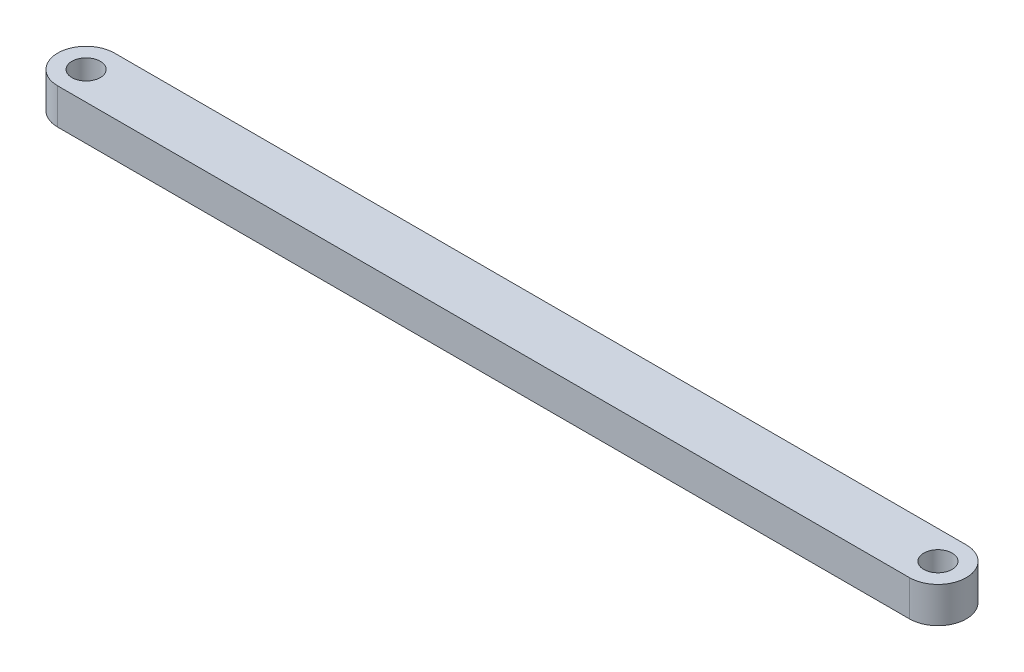
ISO-10303-21;
HEADER;
FILE_DESCRIPTION(('STEP AP214'),'2;1');
FILE_NAME('part.step','',(''),(''),'','','');
FILE_SCHEMA(('AUTOMOTIVE_DESIGN { 1 0 10303 214 1 1 1 1 }'));
ENDSEC;
DATA;
#1=APPLICATION_CONTEXT('core data for automotive mechanical design processes');
#2=APPLICATION_PROTOCOL_DEFINITION('international standard','automotive_design',2000,#1);
#3=PRODUCT_CONTEXT('',#1,'mechanical');
#4=PRODUCT('Part','Part','',(#3));
#5=PRODUCT_RELATED_PRODUCT_CATEGORY('part','',(#4));
#6=PRODUCT_DEFINITION_FORMATION('','',#4);
#7=PRODUCT_DEFINITION_CONTEXT('part definition',#1,'design');
#8=PRODUCT_DEFINITION('design','',#6,#7);
#9=PRODUCT_DEFINITION_SHAPE('','',#8);
#10=(LENGTH_UNIT() NAMED_UNIT(*) SI_UNIT(.MILLI.,.METRE.));
#11=(NAMED_UNIT(*) PLANE_ANGLE_UNIT() SI_UNIT($,.RADIAN.));
#12=(NAMED_UNIT(*) SI_UNIT($,.STERADIAN.) SOLID_ANGLE_UNIT());
#13=UNCERTAINTY_MEASURE_WITH_UNIT(LENGTH_MEASURE(1.E-05),#10,'distance_accuracy_value','');
#14=(GEOMETRIC_REPRESENTATION_CONTEXT(3) GLOBAL_UNCERTAINTY_ASSIGNED_CONTEXT((#13)) GLOBAL_UNIT_ASSIGNED_CONTEXT((#10,
#11,#12)) REPRESENTATION_CONTEXT('',''));
#15=CARTESIAN_POINT('',(0.,0.,0.));
#16=DIRECTION('',(0.,0.,1.));
#17=DIRECTION('',(1.,0.,0.));
#18=AXIS2_PLACEMENT_3D('',#15,#16,#17);
#19=CARTESIAN_POINT('',(0.,3.2004,-2.54000000001069));
#20=DIRECTION('',(0.,0.,-1.));
#21=DIRECTION('',(-1.,0.,0.));
#22=AXIS2_PLACEMENT_3D('',#19,#20,#21);
#23=PLANE('',#22);
#24=DIRECTION('',(1.,0.,0.));
#25=VECTOR('',#24,1.);
#26=CARTESIAN_POINT('',(0.,0.,-2.54000000001069));
#27=LINE('',#26,#25);
#28=CARTESIAN_POINT('',(-95.2499999914238,0.,-2.54000000001069));
#29=VERTEX_POINT('',#28);
#30=CARTESIAN_POINT('',(-19.0499999914238,0.,-2.54000000001069));
#31=VERTEX_POINT('',#30);
#32=EDGE_CURVE('E104',#29,#31,#27,.T.);
#33=ORIENTED_EDGE('',*,*,#32,.T.);
#34=DIRECTION('',(0.,-1.,0.));
#35=VECTOR('',#34,1.);
#36=CARTESIAN_POINT('',(-19.0499999914238,3.2004,-2.54000000001069));
#37=LINE('',#36,#35);
#38=CARTESIAN_POINT('',(-19.0499999914238,3.2004,-2.54000000001069));
#39=VERTEX_POINT('',#38);
#40=EDGE_CURVE('E11',#39,#31,#37,.T.);
#41=ORIENTED_EDGE('',*,*,#40,.F.);
#42=DIRECTION('',(1.,0.,0.));
#43=VECTOR('',#42,1.);
#44=CARTESIAN_POINT('',(0.,3.2004,-2.54000000001069));
#45=LINE('',#44,#43);
#46=CARTESIAN_POINT('',(-95.2499999914238,3.2004,-2.54000000001069));
#47=VERTEX_POINT('',#46);
#48=EDGE_CURVE('E83',#47,#39,#45,.T.);
#49=ORIENTED_EDGE('',*,*,#48,.F.);
#50=DIRECTION('',(0.,-1.,0.));
#51=VECTOR('',#50,1.);
#52=CARTESIAN_POINT('',(-95.2499999914238,3.2004,-2.54000000001069));
#53=LINE('',#52,#51);
#54=EDGE_CURVE('E94',#47,#29,#53,.T.);
#55=ORIENTED_EDGE('',*,*,#54,.T.);
#56=EDGE_LOOP('',(#33,#41,#49,#55));
#57=FACE_BOUND('',#56,.T.);
#58=ADVANCED_FACE('F35',(#57),#23,.F.);
#59=CARTESIAN_POINT('',(-19.0499999914238,3.2004,-5.08000000001069));
#60=DIRECTION('',(0.,-1.,0.));
#61=DIRECTION('',(0.,0.,-1.));
#62=AXIS2_PLACEMENT_3D('',#59,#60,#61);
#63=CYLINDRICAL_SURFACE('',#62,2.54);
#64=CARTESIAN_POINT('',(-19.0499999914238,0.,-5.08000000001069));
#65=DIRECTION('',(0.,1.,0.));
#66=DIRECTION('',(0.,0.,1.));
#67=AXIS2_PLACEMENT_3D('',#64,#65,#66);
#68=CIRCLE('',#67,2.54);
#69=CARTESIAN_POINT('',(-19.0499999914238,0.,-7.62000000001069));
#70=VERTEX_POINT('',#69);
#71=EDGE_CURVE('E88',#31,#70,#68,.T.);
#72=ORIENTED_EDGE('',*,*,#71,.T.);
#73=DIRECTION('',(0.,-1.,0.));
#74=VECTOR('',#73,1.);
#75=CARTESIAN_POINT('',(-19.0499999914238,3.2004,-7.62000000001069));
#76=LINE('',#75,#74);
#77=CARTESIAN_POINT('',(-19.0499999914238,3.2004,-7.62000000001069));
#78=VERTEX_POINT('',#77);
#79=EDGE_CURVE('E44',#78,#70,#76,.T.);
#80=ORIENTED_EDGE('',*,*,#79,.F.);
#81=CARTESIAN_POINT('',(-19.0499999914238,3.2004,-5.08000000001069));
#82=DIRECTION('',(0.,1.,0.));
#83=DIRECTION('',(0.,0.,1.));
#84=AXIS2_PLACEMENT_3D('',#81,#82,#83);
#85=CIRCLE('',#84,2.54);
#86=EDGE_CURVE('E78',#39,#78,#85,.T.);
#87=ORIENTED_EDGE('',*,*,#86,.F.);
#88=ORIENTED_EDGE('',*,*,#40,.T.);
#89=EDGE_LOOP('',(#72,#80,#87,#88));
#90=FACE_BOUND('',#89,.T.);
#91=ADVANCED_FACE('F87',(#90),#63,.T.);
#92=CARTESIAN_POINT('',(0.,3.2004,-7.62000000001069));
#93=DIRECTION('',(0.,0.,-1.));
#94=DIRECTION('',(-1.,0.,0.));
#95=AXIS2_PLACEMENT_3D('',#92,#93,#94);
#96=PLANE('',#95);
#97=DIRECTION('',(1.,0.,0.));
#98=VECTOR('',#97,1.);
#99=CARTESIAN_POINT('',(0.,0.,-7.62000000001069));
#100=LINE('',#99,#98);
#101=CARTESIAN_POINT('',(-95.2499999914238,0.,-7.62000000001069));
#102=VERTEX_POINT('',#101);
#103=EDGE_CURVE('E108',#102,#70,#100,.T.);
#104=ORIENTED_EDGE('',*,*,#103,.F.);
#105=DIRECTION('',(0.,-1.,0.));
#106=VECTOR('',#105,1.);
#107=CARTESIAN_POINT('',(-95.2499999914238,3.2004,-7.62000000001069));
#108=LINE('',#107,#106);
#109=CARTESIAN_POINT('',(-95.2499999914238,3.2004,-7.62000000001069));
#110=VERTEX_POINT('',#109);
#111=EDGE_CURVE('E68',#110,#102,#108,.T.);
#112=ORIENTED_EDGE('',*,*,#111,.F.);
#113=DIRECTION('',(1.,0.,0.));
#114=VECTOR('',#113,1.);
#115=CARTESIAN_POINT('',(0.,3.2004,-7.62000000001069));
#116=LINE('',#115,#114);
#117=EDGE_CURVE('E81',#110,#78,#116,.T.);
#118=ORIENTED_EDGE('',*,*,#117,.T.);
#119=ORIENTED_EDGE('',*,*,#79,.T.);
#120=EDGE_LOOP('',(#104,#112,#118,#119));
#121=FACE_BOUND('',#120,.T.);
#122=ADVANCED_FACE('F92',(#121),#96,.T.);
#123=CARTESIAN_POINT('',(-95.2499999914238,3.2004,-5.08000000001069));
#124=DIRECTION('',(0.,-1.,0.));
#125=DIRECTION('',(0.,0.,-1.));
#126=AXIS2_PLACEMENT_3D('',#123,#124,#125);
#127=CYLINDRICAL_SURFACE('',#126,1.26999999999999);
#128=CARTESIAN_POINT('',(-95.2499999914238,3.2004,-5.08000000001069));
#129=DIRECTION('',(0.,1.,0.));
#130=DIRECTION('',(0.,0.,1.));
#131=AXIS2_PLACEMENT_3D('',#128,#129,#130);
#132=CIRCLE('',#131,1.26999999999999);
#133=CARTESIAN_POINT('',(-95.2499999914238,3.2004,-3.8100000000107));
#134=VERTEX_POINT('',#133);
#135=EDGE_CURVE('E146',#134,#134,#132,.T.);
#136=ORIENTED_EDGE('',*,*,#135,.T.);
#137=EDGE_LOOP('',(#136));
#138=FACE_BOUND('',#137,.T.);
#139=CARTESIAN_POINT('',(-95.2499999914238,0.,-5.08000000001069));
#140=DIRECTION('',(0.,1.,0.));
#141=DIRECTION('',(0.,0.,1.));
#142=AXIS2_PLACEMENT_3D('',#139,#140,#141);
#143=CIRCLE('',#142,1.26999999999999);
#144=CARTESIAN_POINT('',(-95.2499999914238,0.,-3.8100000000107));
#145=VERTEX_POINT('',#144);
#146=EDGE_CURVE('E101',#145,#145,#143,.T.);
#147=ORIENTED_EDGE('',*,*,#146,.F.);
#148=EDGE_LOOP('',(#147));
#149=FACE_BOUND('',#148,.T.);
#150=ADVANCED_FACE('F135',(#138,#149),#127,.F.);
#151=CARTESIAN_POINT('',(-19.0499999914238,3.2004,-5.08000000001069));
#152=DIRECTION('',(0.,-1.,0.));
#153=DIRECTION('',(0.,0.,-1.));
#154=AXIS2_PLACEMENT_3D('',#151,#152,#153);
#155=CYLINDRICAL_SURFACE('',#154,1.27);
#156=CARTESIAN_POINT('',(-19.0499999914238,3.2004,-5.08000000001069));
#157=DIRECTION('',(0.,1.,0.));
#158=DIRECTION('',(0.,0.,1.));
#159=AXIS2_PLACEMENT_3D('',#156,#157,#158);
#160=CIRCLE('',#159,1.27);
#161=CARTESIAN_POINT('',(-19.0499999914238,3.2004,-3.81000000001069));
#162=VERTEX_POINT('',#161);
#163=EDGE_CURVE('E111',#162,#162,#160,.T.);
#164=ORIENTED_EDGE('',*,*,#163,.T.);
#165=EDGE_LOOP('',(#164));
#166=FACE_BOUND('',#165,.T.);
#167=CARTESIAN_POINT('',(-19.0499999914238,0.,-5.08000000001069));
#168=DIRECTION('',(0.,1.,0.));
#169=DIRECTION('',(0.,0.,1.));
#170=AXIS2_PLACEMENT_3D('',#167,#168,#169);
#171=CIRCLE('',#170,1.27);
#172=CARTESIAN_POINT('',(-19.0499999914238,0.,-3.81000000001069));
#173=VERTEX_POINT('',#172);
#174=EDGE_CURVE('E98',#173,#173,#171,.T.);
#175=ORIENTED_EDGE('',*,*,#174,.F.);
#176=EDGE_LOOP('',(#175));
#177=FACE_BOUND('',#176,.T.);
#178=ADVANCED_FACE('F37',(#166,#177),#155,.F.);
#179=CARTESIAN_POINT('',(-95.2499999914238,3.2004,-5.08000000001069));
#180=DIRECTION('',(0.,-1.,0.));
#181=DIRECTION('',(0.,0.,-1.));
#182=AXIS2_PLACEMENT_3D('',#179,#180,#181);
#183=CYLINDRICAL_SURFACE('',#182,2.54);
#184=CARTESIAN_POINT('',(-95.2499999914238,0.,-5.08000000001069));
#185=DIRECTION('',(0.,1.,0.));
#186=DIRECTION('',(0.,0.,1.));
#187=AXIS2_PLACEMENT_3D('',#184,#185,#186);
#188=CIRCLE('',#187,2.54);
#189=EDGE_CURVE('E71',#102,#29,#188,.T.);
#190=ORIENTED_EDGE('',*,*,#189,.T.);
#191=ORIENTED_EDGE('',*,*,#54,.F.);
#192=CARTESIAN_POINT('',(-95.2499999914238,3.2004,-5.08000000001069));
#193=DIRECTION('',(0.,1.,0.));
#194=DIRECTION('',(0.,0.,1.));
#195=AXIS2_PLACEMENT_3D('',#192,#193,#194);
#196=CIRCLE('',#195,2.54);
#197=EDGE_CURVE('E52',#110,#47,#196,.T.);
#198=ORIENTED_EDGE('',*,*,#197,.F.);
#199=ORIENTED_EDGE('',*,*,#111,.T.);
#200=EDGE_LOOP('',(#190,#191,#198,#199));
#201=FACE_BOUND('',#200,.T.);
#202=ADVANCED_FACE('F123',(#201),#183,.T.);
#203=CARTESIAN_POINT('',(0.,3.2004,0.));
#204=DIRECTION('',(0.,1.,0.));
#205=DIRECTION('',(0.,0.,1.));
#206=AXIS2_PLACEMENT_3D('',#203,#204,#205);
#207=PLANE('',#206);
#208=ORIENTED_EDGE('',*,*,#163,.F.);
#209=EDGE_LOOP('',(#208));
#210=FACE_BOUND('',#209,.T.);
#211=ORIENTED_EDGE('',*,*,#135,.F.);
#212=EDGE_LOOP('',(#211));
#213=FACE_BOUND('',#212,.T.);
#214=ORIENTED_EDGE('',*,*,#48,.T.);
#215=ORIENTED_EDGE('',*,*,#86,.T.);
#216=ORIENTED_EDGE('',*,*,#117,.F.);
#217=ORIENTED_EDGE('',*,*,#197,.T.);
#218=EDGE_LOOP('',(#214,#215,#216,#217));
#219=FACE_BOUND('',#218,.T.);
#220=ADVANCED_FACE('F79',(#210,#213,#219),#207,.T.);
#221=CARTESIAN_POINT('',(0.,0.,0.));
#222=DIRECTION('',(0.,1.,0.));
#223=DIRECTION('',(0.,0.,1.));
#224=AXIS2_PLACEMENT_3D('',#221,#222,#223);
#225=PLANE('',#224);
#226=ORIENTED_EDGE('',*,*,#174,.T.);
#227=EDGE_LOOP('',(#226));
#228=FACE_BOUND('',#227,.T.);
#229=ORIENTED_EDGE('',*,*,#146,.T.);
#230=EDGE_LOOP('',(#229));
#231=FACE_BOUND('',#230,.T.);
#232=ORIENTED_EDGE('',*,*,#32,.F.);
#233=ORIENTED_EDGE('',*,*,#189,.F.);
#234=ORIENTED_EDGE('',*,*,#103,.T.);
#235=ORIENTED_EDGE('',*,*,#71,.F.);
#236=EDGE_LOOP('',(#232,#233,#234,#235));
#237=FACE_BOUND('',#236,.T.);
#238=ADVANCED_FACE('F116',(#228,#231,#237),#225,.F.);
#239=CLOSED_SHELL('',(#58,#91,#122,#150,#178,#202,#220,#238));
#240=MANIFOLD_SOLID_BREP('B2',#239);
#241=ADVANCED_BREP_SHAPE_REPRESENTATION('',(#18,#240),#14);
#242=SHAPE_DEFINITION_REPRESENTATION(#9,#241);
ENDSEC;
END-ISO-10303-21;
